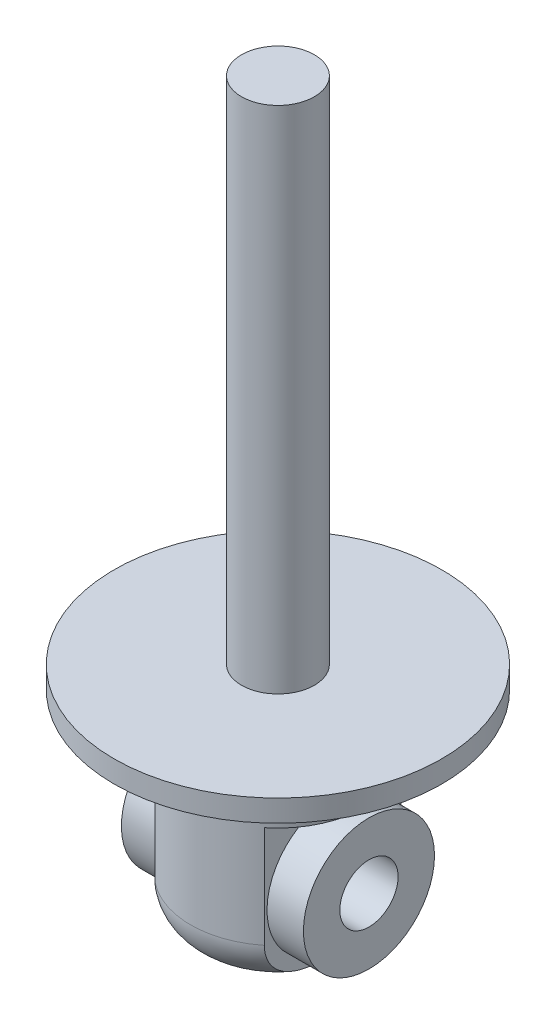
ISO-10303-21;
HEADER;
FILE_DESCRIPTION(('STEP AP214'),'2;1');
FILE_NAME('part.step','',(''),(''),'','','');
FILE_SCHEMA(('AUTOMOTIVE_DESIGN { 1 0 10303 214 1 1 1 1 }'));
ENDSEC;
DATA;
#1=APPLICATION_CONTEXT('core data for automotive mechanical design processes');
#2=APPLICATION_PROTOCOL_DEFINITION('international standard','automotive_design',2000,#1);
#3=PRODUCT_CONTEXT('',#1,'mechanical');
#4=PRODUCT('Part','Part','',(#3));
#5=PRODUCT_RELATED_PRODUCT_CATEGORY('part','',(#4));
#6=PRODUCT_DEFINITION_FORMATION('','',#4);
#7=PRODUCT_DEFINITION_CONTEXT('part definition',#1,'design');
#8=PRODUCT_DEFINITION('design','',#6,#7);
#9=PRODUCT_DEFINITION_SHAPE('','',#8);
#10=(LENGTH_UNIT() NAMED_UNIT(*) SI_UNIT(.MILLI.,.METRE.));
#11=(NAMED_UNIT(*) PLANE_ANGLE_UNIT() SI_UNIT($,.RADIAN.));
#12=(NAMED_UNIT(*) SI_UNIT($,.STERADIAN.) SOLID_ANGLE_UNIT());
#13=UNCERTAINTY_MEASURE_WITH_UNIT(LENGTH_MEASURE(1.E-05),#10,'distance_accuracy_value','');
#14=(GEOMETRIC_REPRESENTATION_CONTEXT(3) GLOBAL_UNCERTAINTY_ASSIGNED_CONTEXT((#13)) GLOBAL_UNIT_ASSIGNED_CONTEXT((#10,
#11,#12)) REPRESENTATION_CONTEXT('',''));
#15=CARTESIAN_POINT('',(0.,0.,0.));
#16=DIRECTION('',(0.,0.,1.));
#17=DIRECTION('',(1.,0.,0.));
#18=AXIS2_PLACEMENT_3D('',#15,#16,#17);
#19=CARTESIAN_POINT('',(7.5,-8.,-22.5));
#20=DIRECTION('',(-1.,0.,0.));
#21=DIRECTION('',(0.,-1.,0.));
#22=AXIS2_PLACEMENT_3D('',#19,#20,#21);
#23=PLANE('',#22);
#24=CARTESIAN_POINT('',(7.5,-27.8094750193111,0.));
#25=CARTESIAN_POINT('',(7.5,-27.8094752958151,-0.18452162824242));
#26=CARTESIAN_POINT('',(7.5,-27.8077270322999,-0.369043480287192));
#27=CARTESIAN_POINT('',(7.5,-27.8006130628877,-0.737999394292286));
#28=CARTESIAN_POINT('',(7.5,-27.7952477367066,-0.922433463434386));
#29=CARTESIAN_POINT('',(7.5,-27.780538513706,-1.29122559425462));
#30=CARTESIAN_POINT('',(7.5,-27.7711929215574,-1.47558358999919));
#31=CARTESIAN_POINT('',(7.5,-27.7479507640883,-1.84401846668315));
#32=CARTESIAN_POINT('',(7.5,-27.734054140347,-2.0280953439834));
#33=CARTESIAN_POINT('',(7.5,-27.701027325669,-2.39498843631837));
#34=CARTESIAN_POINT('',(7.5,-27.6819201299087,-2.57780665418327));
#35=CARTESIAN_POINT('',(7.5,-27.6375682217561,-2.94269408038084));
#36=CARTESIAN_POINT('',(7.5,-27.6123230495969,-3.12476323156505));
#37=CARTESIAN_POINT('',(7.5,-27.5259360262262,-3.6691632505479));
#38=CARTESIAN_POINT('',(7.5,-27.4541196223952,-4.02997739530099));
#39=CARTESIAN_POINT('',(7.5,-27.315114172541,-4.57935988961709));
#40=CARTESIAN_POINT('',(7.5,-27.2608348848703,-4.7712225645297));
#41=CARTESIAN_POINT('',(7.5,-27.1402411036094,-5.15109529504943));
#42=CARTESIAN_POINT('',(7.5,-27.0739312594077,-5.3391068078654));
#43=CARTESIAN_POINT('',(7.5,-26.9281486989919,-5.70992505463464));
#44=CARTESIAN_POINT('',(7.5,-26.8486797977089,-5.8927332791208));
#45=CARTESIAN_POINT('',(7.5,-26.6756224712841,-6.25155879665884));
#46=CARTESIAN_POINT('',(7.5,-26.5820364486501,-6.4275772388346));
#47=CARTESIAN_POINT('',(7.5,-26.3958384208508,-6.74413785402998));
#48=CARTESIAN_POINT('',(7.5,-26.3053527427416,-6.8859302136676));
#49=CARTESIAN_POINT('',(7.5,-26.1136422044668,-7.16205254122039));
#50=CARTESIAN_POINT('',(7.5,-26.0124194056704,-7.29638393401337));
#51=CARTESIAN_POINT('',(7.5,-25.7991822855038,-7.55627452274062));
#52=CARTESIAN_POINT('',(7.5,-25.6871652583255,-7.6818315054992));
#53=CARTESIAN_POINT('',(7.5,-25.4525813942248,-7.92270374400352));
#54=CARTESIAN_POINT('',(7.5,-25.3300144777409,-8.03801892249803));
#55=CARTESIAN_POINT('',(7.5,-25.0736714823962,-8.25792234562975));
#56=CARTESIAN_POINT('',(7.5,-24.9398051473305,-8.36240569865935));
#57=CARTESIAN_POINT('',(7.5,-24.662616920615,-8.55796576900282));
#58=CARTESIAN_POINT('',(7.5,-24.5192963548439,-8.64904436046083));
#59=CARTESIAN_POINT('',(7.5,-24.2243409104845,-8.81636481076627));
#60=CARTESIAN_POINT('',(7.5,-24.0727112205184,-8.89261579636783));
#61=CARTESIAN_POINT('',(7.5,-23.7624095052739,-9.02909243430965));
#62=CARTESIAN_POINT('',(7.5,-23.6037388369551,-9.08932115899453));
#63=CARTESIAN_POINT('',(7.5,-23.3052245459151,-9.1849514334904));
#64=CARTESIAN_POINT('',(7.5,-23.166136129491,-9.22272405795733));
#65=CARTESIAN_POINT('',(7.5,-22.8851087613884,-9.28547940350164));
#66=CARTESIAN_POINT('',(7.5,-22.7431701638949,-9.31046370365637));
#67=CARTESIAN_POINT('',(7.5,-22.4576599589478,-9.34730641699015));
#68=CARTESIAN_POINT('',(7.5,-22.3140890586128,-9.35917031033292));
#69=CARTESIAN_POINT('',(7.5,-22.0264648581988,-9.36963164548865));
#70=CARTESIAN_POINT('',(7.5,-21.8824115750842,-9.36822954903947));
#71=CARTESIAN_POINT('',(7.5,-21.6061914815275,-9.35280339576898));
#72=CARTESIAN_POINT('',(7.5,-21.4739684759153,-9.33976569953801));
#73=CARTESIAN_POINT('',(7.5,-21.2110534946456,-9.3025636387872));
#74=CARTESIAN_POINT('',(7.5,-21.0803620180608,-9.27839574533065));
#75=CARTESIAN_POINT('',(7.5,-20.8215410609612,-9.21922065645586));
#76=CARTESIAN_POINT('',(7.5,-20.6934101253726,-9.1842198149556));
#77=CARTESIAN_POINT('',(7.5,-20.4404340442512,-9.1037455253616));
#78=CARTESIAN_POINT('',(7.5,-20.3155901493276,-9.05826815366643));
#79=CARTESIAN_POINT('',(7.5,-20.0692031015505,-8.95699564520569));
#80=CARTESIAN_POINT('',(7.5,-19.9476868658852,-8.90113499399755));
#81=CARTESIAN_POINT('',(7.5,-19.7094920695403,-8.77987692751896));
#82=CARTESIAN_POINT('',(7.5,-19.5928152563103,-8.71447610526942));
#83=CARTESIAN_POINT('',(7.5,-19.2509911073174,-8.50489875856371));
#84=CARTESIAN_POINT('',(7.5,-19.0339195251877,-8.34729299116934));
#85=CARTESIAN_POINT('',(7.5,-18.609337427954,-7.98870608163152));
#86=CARTESIAN_POINT('',(7.5,-18.4039002281567,-7.78529755950601));
#87=CARTESIAN_POINT('',(7.5,-18.0246758733926,-7.35109040646742));
#88=CARTESIAN_POINT('',(7.5,-17.8508837047537,-7.12029612399674));
#89=CARTESIAN_POINT('',(7.5,-17.5744409595824,-6.69864287979115));
#90=CARTESIAN_POINT('',(7.5,-17.4648689537028,-6.51223410047273));
#91=CARTESIAN_POINT('',(7.5,-17.2626904112623,-6.13034538679086));
#92=CARTESIAN_POINT('',(7.5,-17.1700919878543,-5.93486117014358));
#93=CARTESIAN_POINT('',(7.5,-17.0006313082269,-5.53658641063457));
#94=CARTESIAN_POINT('',(7.5,-16.9238147555949,-5.3337765932138));
#95=CARTESIAN_POINT('',(7.5,-16.784875362625,-4.9233142846081));
#96=CARTESIAN_POINT('',(7.5,-16.7227484430634,-4.71566315546474));
#97=CARTESIAN_POINT('',(7.5,-16.5386673542946,-4.02250667384635));
#98=CARTESIAN_POINT('',(7.5,-16.4449803111871,-3.52942656369881));
#99=CARTESIAN_POINT('',(7.5,-16.3412352530644,-2.78498720051466));
#100=CARTESIAN_POINT('',(7.5,-16.3127705467372,-2.53568557770049));
#101=CARTESIAN_POINT('',(7.5,-16.2658269581612,-2.03612434937438));
#102=CARTESIAN_POINT('',(7.5,-16.2473468655649,-1.78586486368141));
#103=CARTESIAN_POINT('',(7.5,-16.2184283009414,-1.28363112408652));
#104=CARTESIAN_POINT('',(7.5,-16.208031590786,-1.03165466176091));
#105=CARTESIAN_POINT('',(7.5,-16.1941849220444,-0.527501194688676));
#106=CARTESIAN_POINT('',(7.5,-16.1907352988047,-0.275324180848907));
#107=CARTESIAN_POINT('',(7.5,-16.1903333462322,0.22873134560298));
#108=CARTESIAN_POINT('',(7.5,-16.193373232494,0.480609853630178));
#109=CARTESIAN_POINT('',(7.5,-16.2063332691715,0.98417358149427));
#110=CARTESIAN_POINT('',(7.5,-16.2162528039696,1.23585881660874));
#111=CARTESIAN_POINT('',(7.5,-16.2454935008677,1.76278825668934));
#112=CARTESIAN_POINT('',(7.5,-16.2656211327378,2.03798990109172));
#113=CARTESIAN_POINT('',(7.5,-16.3180418431018,2.58731345976839));
#114=CARTESIAN_POINT('',(7.5,-16.3503365349836,2.86143522597444));
#115=CARTESIAN_POINT('',(7.5,-16.4300545548583,3.40623279358437));
#116=CARTESIAN_POINT('',(7.5,-16.4774071358833,3.67691867401874));
#117=CARTESIAN_POINT('',(7.5,-16.5907053400646,4.21439476079952));
#118=CARTESIAN_POINT('',(7.5,-16.6566449229111,4.4811862031647));
#119=CARTESIAN_POINT('',(7.5,-16.7911834026755,4.94217748017443));
#120=CARTESIAN_POINT('',(7.5,-16.8549558474619,5.13778160857807));
#121=CARTESIAN_POINT('',(7.5,-16.9961265709521,5.5239942274174));
#122=CARTESIAN_POINT('',(7.5,-17.073520789267,5.71460418712137));
#123=CARTESIAN_POINT('',(7.5,-17.2430793617625,6.0892198722189));
#124=CARTESIAN_POINT('',(7.5,-17.3352463319138,6.27322442084438));
#125=CARTESIAN_POINT('',(7.5,-17.5351759469553,6.63256976145457));
#126=CARTESIAN_POINT('',(7.5,-17.6429345063483,6.80791280693598));
#127=CARTESIAN_POINT('',(7.5,-17.8487615005737,7.10989658300674));
#128=CARTESIAN_POINT('',(7.5,-17.9436617626469,7.23870103997639));
#129=CARTESIAN_POINT('',(7.5,-18.143229826346,7.48856622066219));
#130=CARTESIAN_POINT('',(7.5,-18.2478987883735,7.60962602152205));
#131=CARTESIAN_POINT('',(7.5,-18.4668045949393,7.84271387792475));
#132=CARTESIAN_POINT('',(7.5,-18.5810384459287,7.95474473789613));
#133=CARTESIAN_POINT('',(7.5,-18.8187268203134,8.16854933672495));
#134=CARTESIAN_POINT('',(7.5,-18.9421800591116,8.27032449994957));
#135=CARTESIAN_POINT('',(7.5,-19.1987356397018,8.46313596223061));
#136=CARTESIAN_POINT('',(7.5,-19.3319055781875,8.55408255407203));
#137=CARTESIAN_POINT('',(7.5,-19.6061418402457,8.72304401015933));
#138=CARTESIAN_POINT('',(7.5,-19.747204378254,8.80106500403696));
#139=CARTESIAN_POINT('',(7.5,-20.0362068877473,8.94309470867638));
#140=CARTESIAN_POINT('',(7.5,-20.1841460034049,9.00710515749597));
#141=CARTESIAN_POINT('',(7.5,-20.4856380297523,9.12014361193692));
#142=CARTESIAN_POINT('',(7.5,-20.6391901444676,9.16917373274798));
#143=CARTESIAN_POINT('',(7.5,-20.9313639562727,9.24643392787081));
#144=CARTESIAN_POINT('',(7.5,-21.0695088202567,9.27647685632879));
#145=CARTESIAN_POINT('',(7.5,-21.3479315795213,9.32406143536891));
#146=CARTESIAN_POINT('',(7.5,-21.4882092809527,9.34160421520928));
#147=CARTESIAN_POINT('',(7.5,-21.769719609589,9.36396002322678));
#148=CARTESIAN_POINT('',(7.5,-21.9109518422674,9.36877802253041));
#149=CARTESIAN_POINT('',(7.5,-22.1932734390957,9.36563613906261));
#150=CARTESIAN_POINT('',(7.5,-22.3343628067459,9.35767657732182));
#151=CARTESIAN_POINT('',(7.5,-22.6064011749062,9.32998563551062));
#152=CARTESIAN_POINT('',(7.5,-22.7374295539783,9.31102660205278));
#153=CARTESIAN_POINT('',(7.5,-22.9974780227225,9.26218788836621));
#154=CARTESIAN_POINT('',(7.5,-23.1264974548056,9.23230470755187));
#155=CARTESIAN_POINT('',(7.5,-23.3815508516768,9.16196479385525));
#156=CARTESIAN_POINT('',(7.5,-23.5075862018083,9.12151307666088));
#157=CARTESIAN_POINT('',(7.5,-23.7559772755244,9.03044888037393));
#158=CARTESIAN_POINT('',(7.5,-23.8783315975104,8.97983258590813));
#159=CARTESIAN_POINT('',(7.5,-24.1205569584555,8.8680617574251));
#160=CARTESIAN_POINT('',(7.5,-24.2403549182387,8.8067487702029));
#161=CARTESIAN_POINT('',(7.5,-24.4747211723639,8.67480187441993));
#162=CARTESIAN_POINT('',(7.5,-24.5892875713423,8.60416462323317));
#163=CARTESIAN_POINT('',(7.5,-24.9242270275788,8.37928997825773));
#164=CARTESIAN_POINT('',(7.5,-25.13600210755,8.21201407264852));
#165=CARTESIAN_POINT('',(7.5,-25.5504485361803,7.832942739178));
#166=CARTESIAN_POINT('',(7.5,-25.7507010772538,7.61853228584699));
#167=CARTESIAN_POINT('',(7.5,-26.1185076671662,7.16337882817298));
#168=CARTESIAN_POINT('',(7.5,-26.2860513710234,6.92262753032979));
#169=CARTESIAN_POINT('',(7.5,-26.5545024709803,6.4788664395953));
#170=CARTESIAN_POINT('',(7.5,-26.6619013252763,6.279707295078));
#171=CARTESIAN_POINT('',(7.5,-26.858559219587,5.87254463104013));
#172=CARTESIAN_POINT('',(7.5,-26.9478095430477,5.66453691936401));
#173=CARTESIAN_POINT('',(7.5,-27.1096214973705,5.24180758530233));
#174=CARTESIAN_POINT('',(7.5,-27.1821555960046,5.02707553901331));
#175=CARTESIAN_POINT('',(7.5,-27.3121001369762,4.59305326757355));
#176=CARTESIAN_POINT('',(7.5,-27.3695048137837,4.37376133898656));
#177=CARTESIAN_POINT('',(7.5,-27.4981886749365,3.81417726059937));
#178=CARTESIAN_POINT('',(7.5,-27.5604951716191,3.47183296905169));
#179=CARTESIAN_POINT('',(7.5,-27.6609019684328,2.78359200614869));
#180=CARTESIAN_POINT('',(7.5,-27.6989863972919,2.43769315620305));
#181=CARTESIAN_POINT('',(7.5,-27.7425563308733,1.91723181279187));
#182=CARTESIAN_POINT('',(7.5,-27.7548291128016,1.74318957751326));
#183=CARTESIAN_POINT('',(7.5,-27.7753986995787,1.39487161182966));
#184=CARTESIAN_POINT('',(7.5,-27.7836956019396,1.22059588725637));
#185=CARTESIAN_POINT('',(7.5,-27.796777523185,0.871965392986035));
#186=CARTESIAN_POINT('',(7.5,-27.8015635129394,0.697610658492168));
#187=CARTESIAN_POINT('',(7.5,-27.8079121855994,0.348837350643893));
#188=CARTESIAN_POINT('',(7.5,-27.8094747579462,0.174418775305038));
#189=CARTESIAN_POINT('',(7.5,-27.8094750193111,0.));
#190=B_SPLINE_CURVE_WITH_KNOTS('',3,(#24,#25,#26,#27,#28,#29,#30,#31,#32,#33,#34,#35,#36,#37,
#38,#39,#40,#41,#42,#43,#44,#45,#46,#47,#48,#49,#50,#51,#52,#53,#54,#55,#56,#57,#58,#59,#60,#61,
#62,#63,#64,#65,#66,#67,#68,#69,#70,#71,#72,#73,#74,#75,#76,#77,#78,#79,#80,#81,#82,#83,#84,#85,
#86,#87,#88,#89,#90,#91,#92,#93,#94,#95,#96,#97,#98,#99,#100,#101,#102,#103,#104,#105,#106,#107,
#108,#109,#110,#111,#112,#113,#114,#115,#116,#117,#118,#119,#120,#121,#122,#123,#124,#125,#126,
#127,#128,#129,#130,#131,#132,#133,#134,#135,#136,#137,#138,#139,#140,#141,#142,#143,#144,#145,
#146,#147,#148,#149,#150,#151,#152,#153,#154,#155,#156,#157,#158,#159,#160,#161,#162,#163,#164,
#165,#166,#167,#168,#169,#170,#171,#172,#173,#174,#175,#176,#177,#178,#179,#180,#181,#182,#183,
#184,#185,#186,#187,#188,#189),.UNSPECIFIED.,.T.,.F.,(4,2,2,2,2,2,2,2,2,2,2,2,2,2,2,2,2,2,2,2,2,
2,2,2,2,2,2,2,2,2,2,2,2,2,2,2,2,2,2,2,2,2,2,2,2,2,2,2,2,2,2,2,2,2,2,2,2,2,2,2,2,2,2,2,2,2,2,2,2,
2,2,2,2,2,2,2,2,2,2,2,2,2,4),(0.,0.553556541747909,1.10705498067111,1.66078940935171,
2.21453094651203,2.7658672034967,3.31724477121585,4.41912680182767,5.01698525599298,
5.61461314908643,6.21206808675635,6.80942146164093,7.31357153503217,7.81762499361292,
8.32180513447662,8.82598907791494,9.33467160980089,9.84328295415677,10.3515802378956,
10.8597799828438,11.291588037567,11.7233427606026,12.1549170790764,12.5864763761707,
12.9845986570771,13.3828472534997,13.7808627038906,14.1790274594522,14.579795450788,
14.9807069160888,15.7821103743006,16.6461503316802,17.5100532757815,18.1578732554314,
18.8060020817716,19.4559821948789,20.1057815998326,21.6069748462106,22.3596793389022,
23.1122925673176,23.8687687149109,24.6252813779039,25.3808870860739,26.1364251884592,
26.9640249034878,27.7917343993232,28.6156111127982,29.4392203950451,30.0559954213971,
30.6725869093733,31.2892877047367,31.9058271963483,32.3853559200308,32.86494167852,
33.3443778968313,33.823747436381,34.3068464150843,34.7897156366603,35.2725249226045,
35.7552660053908,36.1788379642465,36.6023716529343,37.0257398573389,37.4490974249689,
37.8458122806135,38.2426543730445,38.639308470493,39.0361117351622,39.4393886143668,
39.8428104576491,40.6491243408277,41.5260051520067,42.4031628508039,43.0810551134699,
43.7592721958252,44.4385984678267,45.1181832448308,46.1608437011148,47.2041866484774,
47.7275747628343,48.2509500399341,48.7741805338585,49.2974289735857),.UNSPECIFIED.);
#191=CARTESIAN_POINT('',(7.5,-22.,9.3674969975976));
#192=VERTEX_POINT('',#191);
#193=CARTESIAN_POINT('',(7.5,-21.9999999999999,-9.36749699759765));
#194=VERTEX_POINT('',#193);
#195=EDGE_CURVE('E84',#192,#194,#190,.T.);
#196=ORIENTED_EDGE('',*,*,#195,.T.);
#197=DIRECTION('',(0.,1.,0.));
#198=VECTOR('',#197,1.);
#199=CARTESIAN_POINT('',(7.5,-28.,-9.3674969975976));
#200=LINE('',#199,#198);
#201=CARTESIAN_POINT('',(7.5,-8.,-9.3674969975976));
#202=VERTEX_POINT('',#201);
#203=EDGE_CURVE('E98',#202,#194,#200,.F.);
#204=ORIENTED_EDGE('',*,*,#203,.F.);
#205=DIRECTION('',(0.,0.,1.));
#206=VECTOR('',#205,1.);
#207=CARTESIAN_POINT('',(7.5,-8.,-22.5));
#208=LINE('',#207,#206);
#209=CARTESIAN_POINT('',(7.5,-8.,9.36749699759759));
#210=VERTEX_POINT('',#209);
#211=EDGE_CURVE('E88',#202,#210,#208,.T.);
#212=ORIENTED_EDGE('',*,*,#211,.T.);
#213=DIRECTION('',(0.,1.,0.));
#214=VECTOR('',#213,1.);
#215=CARTESIAN_POINT('',(7.5,-28.,9.3674969975976));
#216=LINE('',#215,#214);
#217=EDGE_CURVE('E51',#192,#210,#216,.T.);
#218=ORIENTED_EDGE('',*,*,#217,.F.);
#219=EDGE_LOOP('',(#196,#204,#212,#218));
#220=FACE_BOUND('',#219,.T.);
#221=CARTESIAN_POINT('',(7.5,-18.,0.));
#222=DIRECTION('',(-1.,0.,0.));
#223=DIRECTION('',(0.,-1.,0.));
#224=AXIS2_PLACEMENT_3D('',#221,#222,#223);
#225=CIRCLE('',#224,9.);
#226=CARTESIAN_POINT('',(7.5,-27.,0.));
#227=VERTEX_POINT('',#226);
#228=EDGE_CURVE('E11',#227,#227,#225,.F.);
#229=ORIENTED_EDGE('',*,*,#228,.F.);
#230=EDGE_LOOP('',(#229));
#231=FACE_BOUND('',#230,.T.);
#232=ADVANCED_FACE('F35',(#220,#231),#23,.F.);
#233=CARTESIAN_POINT('',(0.,3.,0.));
#234=DIRECTION('',(0.,-1.,0.));
#235=DIRECTION('',(0.,0.,-1.));
#236=AXIS2_PLACEMENT_3D('',#233,#234,#235);
#237=CYLINDRICAL_SURFACE('',#236,22.5);
#238=CARTESIAN_POINT('',(0.,3.,0.));
#239=DIRECTION('',(0.,1.,0.));
#240=DIRECTION('',(0.,0.,1.));
#241=AXIS2_PLACEMENT_3D('',#238,#239,#240);
#242=CIRCLE('',#241,22.5);
#243=CARTESIAN_POINT('',(0.,3.,22.5));
#244=VERTEX_POINT('',#243);
#245=EDGE_CURVE('E115',#244,#244,#242,.T.);
#246=ORIENTED_EDGE('',*,*,#245,.F.);
#247=EDGE_LOOP('',(#246));
#248=FACE_BOUND('',#247,.T.);
#249=CARTESIAN_POINT('',(0.,0.,0.));
#250=DIRECTION('',(0.,1.,0.));
#251=DIRECTION('',(0.,0.,1.));
#252=AXIS2_PLACEMENT_3D('',#249,#250,#251);
#253=CIRCLE('',#252,22.5);
#254=CARTESIAN_POINT('',(0.,0.,22.5));
#255=VERTEX_POINT('',#254);
#256=EDGE_CURVE('E112',#255,#255,#253,.T.);
#257=ORIENTED_EDGE('',*,*,#256,.T.);
#258=EDGE_LOOP('',(#257));
#259=FACE_BOUND('',#258,.T.);
#260=ADVANCED_FACE('F159',(#248,#259),#237,.T.);
#261=CARTESIAN_POINT('',(0.,3.,0.));
#262=DIRECTION('',(0.,1.,0.));
#263=DIRECTION('',(0.,0.,1.));
#264=AXIS2_PLACEMENT_3D('',#261,#262,#263);
#265=PLANE('',#264);
#266=CARTESIAN_POINT('',(0.,3.,0.));
#267=DIRECTION('',(0.,1.,0.));
#268=DIRECTION('',(0.,0.,1.));
#269=AXIS2_PLACEMENT_3D('',#266,#267,#268);
#270=CIRCLE('',#269,5.);
#271=CARTESIAN_POINT('',(0.,3.,5.));
#272=VERTEX_POINT('',#271);
#273=EDGE_CURVE('E109',#272,#272,#270,.T.);
#274=ORIENTED_EDGE('',*,*,#273,.F.);
#275=EDGE_LOOP('',(#274));
#276=FACE_BOUND('',#275,.T.);
#277=ORIENTED_EDGE('',*,*,#245,.T.);
#278=EDGE_LOOP('',(#277));
#279=FACE_BOUND('',#278,.T.);
#280=ADVANCED_FACE('F156',(#276,#279),#265,.T.);
#281=CARTESIAN_POINT('',(0.,0.,0.));
#282=DIRECTION('',(0.,1.,0.));
#283=DIRECTION('',(0.,0.,1.));
#284=AXIS2_PLACEMENT_3D('',#281,#282,#283);
#285=PLANE('',#284);
#286=CARTESIAN_POINT('',(0.,0.,0.));
#287=DIRECTION('',(0.,-1.,0.));
#288=DIRECTION('',(0.,0.,-1.));
#289=AXIS2_PLACEMENT_3D('',#286,#287,#288);
#290=CIRCLE('',#289,12.);
#291=CARTESIAN_POINT('',(0.,0.,-12.));
#292=VERTEX_POINT('',#291);
#293=EDGE_CURVE('E105',#292,#292,#290,.T.);
#294=ORIENTED_EDGE('',*,*,#293,.F.);
#295=EDGE_LOOP('',(#294));
#296=FACE_BOUND('',#295,.T.);
#297=ORIENTED_EDGE('',*,*,#256,.F.);
#298=EDGE_LOOP('',(#297));
#299=FACE_BOUND('',#298,.T.);
#300=ADVANCED_FACE('F154',(#296,#299),#285,.F.);
#301=CARTESIAN_POINT('',(0.,73.,0.));
#302=DIRECTION('',(0.,-1.,0.));
#303=DIRECTION('',(0.,0.,-1.));
#304=AXIS2_PLACEMENT_3D('',#301,#302,#303);
#305=CYLINDRICAL_SURFACE('',#304,5.);
#306=CARTESIAN_POINT('',(0.,73.,0.));
#307=DIRECTION('',(0.,1.,0.));
#308=DIRECTION('',(0.,0.,1.));
#309=AXIS2_PLACEMENT_3D('',#306,#307,#308);
#310=CIRCLE('',#309,5.);
#311=CARTESIAN_POINT('',(0.,73.,5.));
#312=VERTEX_POINT('',#311);
#313=EDGE_CURVE('E104',#312,#312,#310,.T.);
#314=ORIENTED_EDGE('',*,*,#313,.F.);
#315=EDGE_LOOP('',(#314));
#316=FACE_BOUND('',#315,.T.);
#317=ORIENTED_EDGE('',*,*,#273,.T.);
#318=EDGE_LOOP('',(#317));
#319=FACE_BOUND('',#318,.T.);
#320=ADVANCED_FACE('F150',(#316,#319),#305,.T.);
#321=CARTESIAN_POINT('',(0.,73.,0.));
#322=DIRECTION('',(0.,1.,0.));
#323=DIRECTION('',(0.,0.,1.));
#324=AXIS2_PLACEMENT_3D('',#321,#322,#323);
#325=PLANE('',#324);
#326=ORIENTED_EDGE('',*,*,#313,.T.);
#327=EDGE_LOOP('',(#326));
#328=FACE_BOUND('',#327,.T.);
#329=ADVANCED_FACE('F147',(#328),#325,.T.);
#330=CARTESIAN_POINT('',(0.,-28.,0.));
#331=DIRECTION('',(0.,1.,0.));
#332=DIRECTION('',(0.,0.,1.));
#333=AXIS2_PLACEMENT_3D('',#330,#331,#332);
#334=CYLINDRICAL_SURFACE('',#333,12.);
#335=CARTESIAN_POINT('',(0.,-22.,0.));
#336=DIRECTION('',(0.,-1.,0.));
#337=DIRECTION('',(0.,0.,-1.));
#338=AXIS2_PLACEMENT_3D('',#335,#336,#337);
#339=CIRCLE('',#338,12.);
#340=CARTESIAN_POINT('',(-7.5,-21.9999999999999,9.36749699759765));
#341=VERTEX_POINT('',#340);
#342=EDGE_CURVE('E123',#341,#192,#339,.F.);
#343=ORIENTED_EDGE('',*,*,#342,.T.);
#344=ORIENTED_EDGE('',*,*,#217,.T.);
#345=CARTESIAN_POINT('',(0.,-8.,0.));
#346=DIRECTION('',(0.,1.,0.));
#347=DIRECTION('',(-1.,0.,0.));
#348=AXIS2_PLACEMENT_3D('',#345,#346,#347);
#349=CIRCLE('',#348,12.);
#350=EDGE_CURVE('E44',#210,#202,#349,.T.);
#351=ORIENTED_EDGE('',*,*,#350,.T.);
#352=ORIENTED_EDGE('',*,*,#203,.T.);
#353=CARTESIAN_POINT('',(-7.5,-22.,-9.3674969975976));
#354=VERTEX_POINT('',#353);
#355=EDGE_CURVE('E97',#194,#354,#339,.F.);
#356=ORIENTED_EDGE('',*,*,#355,.T.);
#357=DIRECTION('',(0.,1.,0.));
#358=VECTOR('',#357,1.);
#359=CARTESIAN_POINT('',(-7.5,-28.,-9.3674969975976));
#360=LINE('',#359,#358);
#361=CARTESIAN_POINT('',(-7.5,-8.,-9.3674969975976));
#362=VERTEX_POINT('',#361);
#363=EDGE_CURVE('E59',#354,#362,#360,.T.);
#364=ORIENTED_EDGE('',*,*,#363,.T.);
#365=CARTESIAN_POINT('',(0.,-8.,0.));
#366=DIRECTION('',(0.,1.,0.));
#367=DIRECTION('',(-1.,0.,0.));
#368=AXIS2_PLACEMENT_3D('',#365,#366,#367);
#369=CIRCLE('',#368,12.);
#370=CARTESIAN_POINT('',(-7.5,-8.,9.36749699759759));
#371=VERTEX_POINT('',#370);
#372=EDGE_CURVE('E79',#362,#371,#369,.T.);
#373=ORIENTED_EDGE('',*,*,#372,.T.);
#374=DIRECTION('',(0.,1.,0.));
#375=VECTOR('',#374,1.);
#376=CARTESIAN_POINT('',(-7.5,-28.,9.3674969975976));
#377=LINE('',#376,#375);
#378=EDGE_CURVE('E87',#371,#341,#377,.F.);
#379=ORIENTED_EDGE('',*,*,#378,.T.);
#380=EDGE_LOOP('',(#343,#344,#351,#352,#356,#364,#373,#379));
#381=FACE_BOUND('',#380,.T.);
#382=ORIENTED_EDGE('',*,*,#293,.T.);
#383=EDGE_LOOP('',(#382));
#384=FACE_BOUND('',#383,.T.);
#385=ADVANCED_FACE('F93',(#381,#384),#334,.T.);
#386=CARTESIAN_POINT('',(0.,-28.,0.));
#387=DIRECTION('',(0.,-1.,0.));
#388=DIRECTION('',(0.,0.,-1.));
#389=AXIS2_PLACEMENT_3D('',#386,#387,#388);
#390=PLANE('',#389);
#391=CARTESIAN_POINT('',(0.,-28.,0.));
#392=DIRECTION('',(0.,-1.,0.));
#393=DIRECTION('',(0.,0.,-1.));
#394=AXIS2_PLACEMENT_3D('',#391,#392,#393);
#395=CIRCLE('',#394,6.);
#396=CARTESIAN_POINT('',(0.,-28.,-6.));
#397=VERTEX_POINT('',#396);
#398=EDGE_CURVE('E108',#397,#397,#395,.T.);
#399=ORIENTED_EDGE('',*,*,#398,.T.);
#400=EDGE_LOOP('',(#399));
#401=FACE_BOUND('',#400,.T.);
#402=ADVANCED_FACE('F141',(#401),#390,.T.);
#403=CARTESIAN_POINT('',(0.,-22.,0.));
#404=DIRECTION('',(0.,-1.,0.));
#405=DIRECTION('',(0.,0.,-1.));
#406=AXIS2_PLACEMENT_3D('',#403,#404,#405);
#407=TOROIDAL_SURFACE('',#406,6.,6.);
#408=ORIENTED_EDGE('',*,*,#195,.F.);
#409=ORIENTED_EDGE('',*,*,#342,.F.);
#410=CARTESIAN_POINT('',(-7.5,-27.8094750193111,0.));
#411=CARTESIAN_POINT('',(-7.5,-27.8094752958151,0.18452162824242));
#412=CARTESIAN_POINT('',(-7.5,-27.8077270322999,0.369043480287192));
#413=CARTESIAN_POINT('',(-7.5,-27.8006130628877,0.737999394292286));
#414=CARTESIAN_POINT('',(-7.5,-27.7952477367066,0.922433463434386));
#415=CARTESIAN_POINT('',(-7.5,-27.780538513706,1.29122559425462));
#416=CARTESIAN_POINT('',(-7.5,-27.7711929215574,1.47558358999919));
#417=CARTESIAN_POINT('',(-7.5,-27.7479507640883,1.84401846668315));
#418=CARTESIAN_POINT('',(-7.5,-27.734054140347,2.0280953439834));
#419=CARTESIAN_POINT('',(-7.5,-27.701027325669,2.39498843631837));
#420=CARTESIAN_POINT('',(-7.5,-27.6819201299087,2.57780665418327));
#421=CARTESIAN_POINT('',(-7.5,-27.6375682217561,2.94269408038084));
#422=CARTESIAN_POINT('',(-7.5,-27.6123230495969,3.12476323156505));
#423=CARTESIAN_POINT('',(-7.5,-27.5259360262262,3.6691632505479));
#424=CARTESIAN_POINT('',(-7.5,-27.4541196223952,4.02997739530099));
#425=CARTESIAN_POINT('',(-7.5,-27.315114172541,4.57935988961709));
#426=CARTESIAN_POINT('',(-7.5,-27.2608348848703,4.7712225645297));
#427=CARTESIAN_POINT('',(-7.5,-27.1402411036094,5.15109529504943));
#428=CARTESIAN_POINT('',(-7.5,-27.0739312594077,5.3391068078654));
#429=CARTESIAN_POINT('',(-7.5,-26.9281486989919,5.70992505463464));
#430=CARTESIAN_POINT('',(-7.5,-26.8486797977089,5.8927332791208));
#431=CARTESIAN_POINT('',(-7.5,-26.6756224712841,6.25155879665884));
#432=CARTESIAN_POINT('',(-7.5,-26.5820364486501,6.4275772388346));
#433=CARTESIAN_POINT('',(-7.5,-26.3958384208508,6.74413785402998));
#434=CARTESIAN_POINT('',(-7.5,-26.3053527427416,6.8859302136676));
#435=CARTESIAN_POINT('',(-7.5,-26.1136422044668,7.16205254122039));
#436=CARTESIAN_POINT('',(-7.5,-26.0124194056704,7.29638393401337));
#437=CARTESIAN_POINT('',(-7.5,-25.7991822855038,7.55627452274062));
#438=CARTESIAN_POINT('',(-7.5,-25.6871652583255,7.6818315054992));
#439=CARTESIAN_POINT('',(-7.5,-25.4525813942248,7.92270374400352));
#440=CARTESIAN_POINT('',(-7.5,-25.3300144777409,8.03801892249803));
#441=CARTESIAN_POINT('',(-7.5,-25.0736714823962,8.25792234562975));
#442=CARTESIAN_POINT('',(-7.5,-24.9398051473305,8.36240569865935));
#443=CARTESIAN_POINT('',(-7.5,-24.662616920615,8.55796576900282));
#444=CARTESIAN_POINT('',(-7.5,-24.5192963548439,8.64904436046083));
#445=CARTESIAN_POINT('',(-7.5,-24.2243409104845,8.81636481076627));
#446=CARTESIAN_POINT('',(-7.5,-24.0727112205184,8.89261579636783));
#447=CARTESIAN_POINT('',(-7.5,-23.7624095052739,9.02909243430965));
#448=CARTESIAN_POINT('',(-7.5,-23.6037388369551,9.08932115899453));
#449=CARTESIAN_POINT('',(-7.5,-23.3052245459151,9.1849514334904));
#450=CARTESIAN_POINT('',(-7.5,-23.166136129491,9.22272405795733));
#451=CARTESIAN_POINT('',(-7.5,-22.8851087613884,9.28547940350164));
#452=CARTESIAN_POINT('',(-7.5,-22.7431701638949,9.31046370365637));
#453=CARTESIAN_POINT('',(-7.5,-22.4576599589478,9.34730641699015));
#454=CARTESIAN_POINT('',(-7.5,-22.3140890586128,9.35917031033292));
#455=CARTESIAN_POINT('',(-7.5,-22.0264648581988,9.36963164548865));
#456=CARTESIAN_POINT('',(-7.5,-21.8824115750842,9.36822954903947));
#457=CARTESIAN_POINT('',(-7.5,-21.6061914815275,9.35280339576898));
#458=CARTESIAN_POINT('',(-7.5,-21.4739684759153,9.33976569953801));
#459=CARTESIAN_POINT('',(-7.5,-21.2110534946456,9.3025636387872));
#460=CARTESIAN_POINT('',(-7.5,-21.0803620180608,9.27839574533065));
#461=CARTESIAN_POINT('',(-7.5,-20.8215410609612,9.21922065645586));
#462=CARTESIAN_POINT('',(-7.5,-20.6934101253726,9.1842198149556));
#463=CARTESIAN_POINT('',(-7.5,-20.4404340442512,9.1037455253616));
#464=CARTESIAN_POINT('',(-7.5,-20.3155901493276,9.05826815366643));
#465=CARTESIAN_POINT('',(-7.5,-20.0692031015505,8.95699564520569));
#466=CARTESIAN_POINT('',(-7.5,-19.9476868658852,8.90113499399755));
#467=CARTESIAN_POINT('',(-7.5,-19.7094920695403,8.77987692751896));
#468=CARTESIAN_POINT('',(-7.5,-19.5928152563103,8.71447610526942));
#469=CARTESIAN_POINT('',(-7.5,-19.2509911073174,8.50489875856371));
#470=CARTESIAN_POINT('',(-7.5,-19.0339195251877,8.34729299116934));
#471=CARTESIAN_POINT('',(-7.5,-18.609337427954,7.98870608163152));
#472=CARTESIAN_POINT('',(-7.5,-18.4039002281567,7.78529755950601));
#473=CARTESIAN_POINT('',(-7.5,-18.0246758733926,7.35109040646742));
#474=CARTESIAN_POINT('',(-7.5,-17.8508837047537,7.12029612399674));
#475=CARTESIAN_POINT('',(-7.5,-17.5744409595824,6.69864287979115));
#476=CARTESIAN_POINT('',(-7.5,-17.4648689537028,6.51223410047273));
#477=CARTESIAN_POINT('',(-7.5,-17.2626904112623,6.13034538679086));
#478=CARTESIAN_POINT('',(-7.5,-17.1700919878543,5.93486117014358));
#479=CARTESIAN_POINT('',(-7.5,-17.0006313082269,5.53658641063457));
#480=CARTESIAN_POINT('',(-7.5,-16.9238147555949,5.3337765932138));
#481=CARTESIAN_POINT('',(-7.5,-16.784875362625,4.9233142846081));
#482=CARTESIAN_POINT('',(-7.5,-16.7227484430634,4.71566315546474));
#483=CARTESIAN_POINT('',(-7.5,-16.5386673542946,4.02250667384635));
#484=CARTESIAN_POINT('',(-7.5,-16.4449803111871,3.52942656369881));
#485=CARTESIAN_POINT('',(-7.5,-16.3412352530644,2.78498720051466));
#486=CARTESIAN_POINT('',(-7.5,-16.3127705467372,2.53568557770049));
#487=CARTESIAN_POINT('',(-7.5,-16.2658269581612,2.03612434937438));
#488=CARTESIAN_POINT('',(-7.5,-16.2473468655649,1.78586486368141));
#489=CARTESIAN_POINT('',(-7.5,-16.2184283009414,1.28363112408652));
#490=CARTESIAN_POINT('',(-7.5,-16.208031590786,1.03165466176091));
#491=CARTESIAN_POINT('',(-7.5,-16.1941849220444,0.527501194688676));
#492=CARTESIAN_POINT('',(-7.5,-16.1907352988047,0.275324180848907));
#493=CARTESIAN_POINT('',(-7.5,-16.1903333462322,-0.22873134560298));
#494=CARTESIAN_POINT('',(-7.5,-16.193373232494,-0.480609853630178));
#495=CARTESIAN_POINT('',(-7.5,-16.2063332691715,-0.98417358149427));
#496=CARTESIAN_POINT('',(-7.5,-16.2162528039696,-1.23585881660874));
#497=CARTESIAN_POINT('',(-7.5,-16.2454935008677,-1.76278825668934));
#498=CARTESIAN_POINT('',(-7.5,-16.2656211327378,-2.03798990109172));
#499=CARTESIAN_POINT('',(-7.5,-16.3180418431018,-2.58731345976839));
#500=CARTESIAN_POINT('',(-7.5,-16.3503365349836,-2.86143522597444));
#501=CARTESIAN_POINT('',(-7.5,-16.4300545548583,-3.40623279358437));
#502=CARTESIAN_POINT('',(-7.5,-16.4774071358833,-3.67691867401874));
#503=CARTESIAN_POINT('',(-7.5,-16.5907053400646,-4.21439476079952));
#504=CARTESIAN_POINT('',(-7.5,-16.6566449229111,-4.4811862031647));
#505=CARTESIAN_POINT('',(-7.5,-16.7911834026755,-4.94217748017443));
#506=CARTESIAN_POINT('',(-7.5,-16.8549558474619,-5.13778160857807));
#507=CARTESIAN_POINT('',(-7.5,-16.9961265709521,-5.5239942274174));
#508=CARTESIAN_POINT('',(-7.5,-17.073520789267,-5.71460418712137));
#509=CARTESIAN_POINT('',(-7.5,-17.2430793617625,-6.0892198722189));
#510=CARTESIAN_POINT('',(-7.5,-17.3352463319138,-6.27322442084438));
#511=CARTESIAN_POINT('',(-7.5,-17.5351759469553,-6.63256976145457));
#512=CARTESIAN_POINT('',(-7.5,-17.6429345063483,-6.80791280693598));
#513=CARTESIAN_POINT('',(-7.5,-17.8487615005737,-7.10989658300674));
#514=CARTESIAN_POINT('',(-7.5,-17.9436617626469,-7.23870103997639));
#515=CARTESIAN_POINT('',(-7.5,-18.143229826346,-7.48856622066219));
#516=CARTESIAN_POINT('',(-7.5,-18.2478987883735,-7.60962602152205));
#517=CARTESIAN_POINT('',(-7.5,-18.4668045949393,-7.84271387792475));
#518=CARTESIAN_POINT('',(-7.5,-18.5810384459287,-7.95474473789613));
#519=CARTESIAN_POINT('',(-7.5,-18.8187268203134,-8.16854933672495));
#520=CARTESIAN_POINT('',(-7.5,-18.9421800591116,-8.27032449994957));
#521=CARTESIAN_POINT('',(-7.5,-19.1987356397018,-8.46313596223061));
#522=CARTESIAN_POINT('',(-7.5,-19.3319055781875,-8.55408255407203));
#523=CARTESIAN_POINT('',(-7.5,-19.6061418402457,-8.72304401015933));
#524=CARTESIAN_POINT('',(-7.5,-19.747204378254,-8.80106500403696));
#525=CARTESIAN_POINT('',(-7.5,-20.0362068877473,-8.94309470867638));
#526=CARTESIAN_POINT('',(-7.5,-20.1841460034049,-9.00710515749597));
#527=CARTESIAN_POINT('',(-7.5,-20.4856380297523,-9.12014361193692));
#528=CARTESIAN_POINT('',(-7.5,-20.6391901444676,-9.16917373274798));
#529=CARTESIAN_POINT('',(-7.5,-20.9313639562727,-9.24643392787081));
#530=CARTESIAN_POINT('',(-7.5,-21.0695088202567,-9.27647685632879));
#531=CARTESIAN_POINT('',(-7.5,-21.3479315795213,-9.32406143536891));
#532=CARTESIAN_POINT('',(-7.5,-21.4882092809527,-9.34160421520928));
#533=CARTESIAN_POINT('',(-7.5,-21.769719609589,-9.36396002322678));
#534=CARTESIAN_POINT('',(-7.5,-21.9109518422674,-9.36877802253041));
#535=CARTESIAN_POINT('',(-7.5,-22.1932734390957,-9.36563613906261));
#536=CARTESIAN_POINT('',(-7.5,-22.3343628067459,-9.35767657732182));
#537=CARTESIAN_POINT('',(-7.5,-22.6064011749062,-9.32998563551062));
#538=CARTESIAN_POINT('',(-7.5,-22.7374295539783,-9.31102660205278));
#539=CARTESIAN_POINT('',(-7.5,-22.9974780227225,-9.26218788836621));
#540=CARTESIAN_POINT('',(-7.5,-23.1264974548056,-9.23230470755187));
#541=CARTESIAN_POINT('',(-7.5,-23.3815508516768,-9.16196479385525));
#542=CARTESIAN_POINT('',(-7.5,-23.5075862018083,-9.12151307666088));
#543=CARTESIAN_POINT('',(-7.5,-23.7559772755244,-9.03044888037393));
#544=CARTESIAN_POINT('',(-7.5,-23.8783315975104,-8.97983258590813));
#545=CARTESIAN_POINT('',(-7.5,-24.1205569584555,-8.8680617574251));
#546=CARTESIAN_POINT('',(-7.5,-24.2403549182387,-8.8067487702029));
#547=CARTESIAN_POINT('',(-7.5,-24.4747211723639,-8.67480187441993));
#548=CARTESIAN_POINT('',(-7.5,-24.5892875713423,-8.60416462323317));
#549=CARTESIAN_POINT('',(-7.5,-24.9242270275788,-8.37928997825773));
#550=CARTESIAN_POINT('',(-7.5,-25.13600210755,-8.21201407264852));
#551=CARTESIAN_POINT('',(-7.5,-25.5504485361803,-7.832942739178));
#552=CARTESIAN_POINT('',(-7.5,-25.7507010772538,-7.61853228584699));
#553=CARTESIAN_POINT('',(-7.5,-26.1185076671662,-7.16337882817298));
#554=CARTESIAN_POINT('',(-7.5,-26.2860513710234,-6.92262753032979));
#555=CARTESIAN_POINT('',(-7.5,-26.5545024709803,-6.4788664395953));
#556=CARTESIAN_POINT('',(-7.5,-26.6619013252763,-6.279707295078));
#557=CARTESIAN_POINT('',(-7.5,-26.858559219587,-5.87254463104013));
#558=CARTESIAN_POINT('',(-7.5,-26.9478095430477,-5.66453691936401));
#559=CARTESIAN_POINT('',(-7.5,-27.1096214973705,-5.24180758530233));
#560=CARTESIAN_POINT('',(-7.5,-27.1821555960046,-5.02707553901331));
#561=CARTESIAN_POINT('',(-7.5,-27.3121001369762,-4.59305326757355));
#562=CARTESIAN_POINT('',(-7.5,-27.3695048137837,-4.37376133898656));
#563=CARTESIAN_POINT('',(-7.5,-27.4981886749365,-3.81417726059937));
#564=CARTESIAN_POINT('',(-7.5,-27.5604951716191,-3.47183296905169));
#565=CARTESIAN_POINT('',(-7.5,-27.6609019684328,-2.78359200614869));
#566=CARTESIAN_POINT('',(-7.5,-27.6989863972919,-2.43769315620305));
#567=CARTESIAN_POINT('',(-7.5,-27.7425563308733,-1.91723181279187));
#568=CARTESIAN_POINT('',(-7.5,-27.7548291128016,-1.74318957751326));
#569=CARTESIAN_POINT('',(-7.5,-27.7753986995787,-1.39487161182966));
#570=CARTESIAN_POINT('',(-7.5,-27.7836956019396,-1.22059588725637));
#571=CARTESIAN_POINT('',(-7.5,-27.796777523185,-0.871965392986035));
#572=CARTESIAN_POINT('',(-7.5,-27.8015635129394,-0.697610658492168));
#573=CARTESIAN_POINT('',(-7.5,-27.8079121855994,-0.348837350643893));
#574=CARTESIAN_POINT('',(-7.5,-27.8094747579462,-0.174418775305038));
#575=CARTESIAN_POINT('',(-7.5,-27.8094750193111,0.));
#576=B_SPLINE_CURVE_WITH_KNOTS('',3,(#410,#411,#412,#413,#414,#415,#416,#417,#418,#419,#420,
#421,#422,#423,#424,#425,#426,#427,#428,#429,#430,#431,#432,#433,#434,#435,#436,#437,#438,#439,
#440,#441,#442,#443,#444,#445,#446,#447,#448,#449,#450,#451,#452,#453,#454,#455,#456,#457,#458,
#459,#460,#461,#462,#463,#464,#465,#466,#467,#468,#469,#470,#471,#472,#473,#474,#475,#476,#477,
#478,#479,#480,#481,#482,#483,#484,#485,#486,#487,#488,#489,#490,#491,#492,#493,#494,#495,#496,
#497,#498,#499,#500,#501,#502,#503,#504,#505,#506,#507,#508,#509,#510,#511,#512,#513,#514,#515,
#516,#517,#518,#519,#520,#521,#522,#523,#524,#525,#526,#527,#528,#529,#530,#531,#532,#533,#534,
#535,#536,#537,#538,#539,#540,#541,#542,#543,#544,#545,#546,#547,#548,#549,#550,#551,#552,#553,
#554,#555,#556,#557,#558,#559,#560,#561,#562,#563,#564,#565,#566,#567,#568,#569,#570,#571,#572,
#573,#574,#575),.UNSPECIFIED.,.T.,.F.,(4,2,2,2,2,2,2,2,2,2,2,2,2,2,2,2,2,2,2,2,2,2,2,2,2,2,2,2,
2,2,2,2,2,2,2,2,2,2,2,2,2,2,2,2,2,2,2,2,2,2,2,2,2,2,2,2,2,2,2,2,2,2,2,2,2,2,2,2,2,2,2,2,2,2,2,2,
2,2,2,2,2,2,4),(0.,0.553556541747909,1.10705498067111,1.66078940935171,2.21453094651203,
2.7658672034967,3.31724477121585,4.41912680182767,5.01698525599298,5.61461314908643,
6.21206808675635,6.80942146164093,7.31357153503217,7.81762499361292,8.32180513447662,
8.82598907791494,9.33467160980089,9.84328295415677,10.3515802378956,10.8597799828438,
11.291588037567,11.7233427606026,12.1549170790764,12.5864763761707,12.9845986570771,
13.3828472534997,13.7808627038906,14.1790274594522,14.579795450788,14.9807069160888,
15.7821103743006,16.6461503316802,17.5100532757815,18.1578732554314,18.8060020817716,
19.4559821948789,20.1057815998326,21.6069748462106,22.3596793389022,23.1122925673176,
23.8687687149109,24.6252813779039,25.3808870860739,26.1364251884592,26.9640249034878,
27.7917343993232,28.6156111127982,29.4392203950451,30.0559954213971,30.6725869093733,
31.2892877047367,31.9058271963483,32.3853559200308,32.86494167852,33.3443778968313,
33.823747436381,34.3068464150843,34.7897156366603,35.2725249226045,35.7552660053908,
36.1788379642465,36.6023716529343,37.0257398573389,37.4490974249689,37.8458122806135,
38.2426543730445,38.639308470493,39.0361117351622,39.4393886143668,39.8428104576491,
40.6491243408277,41.5260051520067,42.4031628508039,43.0810551134699,43.7592721958252,
44.4385984678267,45.1181832448308,46.1608437011148,47.2041866484774,47.7275747628343,
48.2509500399341,48.7741805338585,49.2974289735857),.UNSPECIFIED.);
#577=EDGE_CURVE('E124',#354,#341,#576,.T.);
#578=ORIENTED_EDGE('',*,*,#577,.F.);
#579=ORIENTED_EDGE('',*,*,#355,.F.);
#580=EDGE_LOOP('',(#408,#409,#578,#579));
#581=FACE_BOUND('',#580,.T.);
#582=ORIENTED_EDGE('',*,*,#398,.F.);
#583=EDGE_LOOP('',(#582));
#584=FACE_BOUND('',#583,.T.);
#585=ADVANCED_FACE('F37',(#581,#584),#407,.T.);
#586=CARTESIAN_POINT('',(-29.0311619945623,-8.,-22.5));
#587=DIRECTION('',(0.,1.,0.));
#588=DIRECTION('',(-1.,0.,0.));
#589=AXIS2_PLACEMENT_3D('',#586,#587,#588);
#590=PLANE('',#589);
#591=DIRECTION('',(0.,0.,1.));
#592=VECTOR('',#591,1.);
#593=CARTESIAN_POINT('',(-7.5,-8.,-22.5));
#594=LINE('',#593,#592);
#595=EDGE_CURVE('E81',#362,#371,#594,.T.);
#596=ORIENTED_EDGE('',*,*,#595,.T.);
#597=ORIENTED_EDGE('',*,*,#372,.F.);
#598=EDGE_LOOP('',(#596,#597));
#599=FACE_BOUND('',#598,.T.);
#600=ADVANCED_FACE('F80',(#599),#590,.F.);
#601=CARTESIAN_POINT('',(-7.5,-8.,-22.5));
#602=DIRECTION('',(1.,0.,0.));
#603=DIRECTION('',(0.,1.,0.));
#604=AXIS2_PLACEMENT_3D('',#601,#602,#603);
#605=PLANE('',#604);
#606=CARTESIAN_POINT('',(-7.5,-18.,0.));
#607=DIRECTION('',(1.,0.,0.));
#608=DIRECTION('',(0.,1.,0.));
#609=AXIS2_PLACEMENT_3D('',#606,#607,#608);
#610=CIRCLE('',#609,9.);
#611=CARTESIAN_POINT('',(-7.5,-9.,0.));
#612=VERTEX_POINT('',#611);
#613=EDGE_CURVE('E259',#612,#612,#610,.T.);
#614=ORIENTED_EDGE('',*,*,#613,.T.);
#615=EDGE_LOOP('',(#614));
#616=FACE_BOUND('',#615,.T.);
#617=ORIENTED_EDGE('',*,*,#577,.T.);
#618=ORIENTED_EDGE('',*,*,#378,.F.);
#619=ORIENTED_EDGE('',*,*,#595,.F.);
#620=ORIENTED_EDGE('',*,*,#363,.F.);
#621=EDGE_LOOP('',(#617,#618,#619,#620));
#622=FACE_BOUND('',#621,.T.);
#623=ADVANCED_FACE('F86',(#616,#622),#605,.F.);
#624=CARTESIAN_POINT('',(29.0311619945623,-8.,-22.5));
#625=DIRECTION('',(0.,1.,0.));
#626=DIRECTION('',(-1.,0.,0.));
#627=AXIS2_PLACEMENT_3D('',#624,#625,#626);
#628=PLANE('',#627);
#629=ORIENTED_EDGE('',*,*,#211,.F.);
#630=ORIENTED_EDGE('',*,*,#350,.F.);
#631=EDGE_LOOP('',(#629,#630));
#632=FACE_BOUND('',#631,.T.);
#633=ADVANCED_FACE('F138',(#632),#628,.F.);
#634=CARTESIAN_POINT('',(-22.5,-18.,0.));
#635=DIRECTION('',(1.,0.,0.));
#636=DIRECTION('',(0.,1.,0.));
#637=AXIS2_PLACEMENT_3D('',#634,#635,#636);
#638=CYLINDRICAL_SURFACE('',#637,4.);
#639=CARTESIAN_POINT('',(12.5,-18.,0.));
#640=DIRECTION('',(1.,0.,0.));
#641=DIRECTION('',(0.,1.,0.));
#642=AXIS2_PLACEMENT_3D('',#639,#640,#641);
#643=CIRCLE('',#642,4.);
#644=CARTESIAN_POINT('',(12.5,-14.,0.));
#645=VERTEX_POINT('',#644);
#646=EDGE_CURVE('E253',#645,#645,#643,.T.);
#647=ORIENTED_EDGE('',*,*,#646,.T.);
#648=EDGE_LOOP('',(#647));
#649=FACE_BOUND('',#648,.T.);
#650=CARTESIAN_POINT('',(-12.5,-18.,0.));
#651=DIRECTION('',(1.,0.,0.));
#652=DIRECTION('',(0.,1.,0.));
#653=AXIS2_PLACEMENT_3D('',#650,#651,#652);
#654=CIRCLE('',#653,4.);
#655=CARTESIAN_POINT('',(-12.5,-14.,0.));
#656=VERTEX_POINT('',#655);
#657=EDGE_CURVE('E262',#656,#656,#654,.T.);
#658=ORIENTED_EDGE('',*,*,#657,.F.);
#659=EDGE_LOOP('',(#658));
#660=FACE_BOUND('',#659,.T.);
#661=ADVANCED_FACE('F178',(#649,#660),#638,.F.);
#662=CARTESIAN_POINT('',(12.5,-18.,0.));
#663=DIRECTION('',(1.,0.,0.));
#664=DIRECTION('',(0.,1.,0.));
#665=AXIS2_PLACEMENT_3D('',#662,#663,#664);
#666=PLANE('',#665);
#667=CARTESIAN_POINT('',(12.5,-18.,0.));
#668=DIRECTION('',(1.,0.,0.));
#669=DIRECTION('',(0.,1.,0.));
#670=AXIS2_PLACEMENT_3D('',#667,#668,#669);
#671=CIRCLE('',#670,9.);
#672=CARTESIAN_POINT('',(12.5,-9.,0.));
#673=VERTEX_POINT('',#672);
#674=EDGE_CURVE('E89',#673,#673,#671,.T.);
#675=ORIENTED_EDGE('',*,*,#674,.T.);
#676=EDGE_LOOP('',(#675));
#677=FACE_BOUND('',#676,.T.);
#678=ORIENTED_EDGE('',*,*,#646,.F.);
#679=EDGE_LOOP('',(#678));
#680=FACE_BOUND('',#679,.T.);
#681=ADVANCED_FACE('F185',(#677,#680),#666,.T.);
#682=CARTESIAN_POINT('',(12.5,-18.,0.));
#683=DIRECTION('',(-1.,0.,0.));
#684=DIRECTION('',(0.,-1.,0.));
#685=AXIS2_PLACEMENT_3D('',#682,#683,#684);
#686=CYLINDRICAL_SURFACE('',#685,9.);
#687=ORIENTED_EDGE('',*,*,#674,.F.);
#688=EDGE_LOOP('',(#687));
#689=FACE_BOUND('',#688,.T.);
#690=ORIENTED_EDGE('',*,*,#228,.T.);
#691=EDGE_LOOP('',(#690));
#692=FACE_BOUND('',#691,.T.);
#693=ADVANCED_FACE('F211',(#689,#692),#686,.T.);
#694=CARTESIAN_POINT('',(-12.5,-18.,0.));
#695=DIRECTION('',(1.,0.,0.));
#696=DIRECTION('',(0.,1.,0.));
#697=AXIS2_PLACEMENT_3D('',#694,#695,#696);
#698=CYLINDRICAL_SURFACE('',#697,9.);
#699=CARTESIAN_POINT('',(-12.5,-18.,0.));
#700=DIRECTION('',(1.,0.,0.));
#701=DIRECTION('',(0.,1.,0.));
#702=AXIS2_PLACEMENT_3D('',#699,#700,#701);
#703=CIRCLE('',#702,9.);
#704=CARTESIAN_POINT('',(-12.5,-9.,0.));
#705=VERTEX_POINT('',#704);
#706=EDGE_CURVE('E256',#705,#705,#703,.T.);
#707=ORIENTED_EDGE('',*,*,#706,.T.);
#708=EDGE_LOOP('',(#707));
#709=FACE_BOUND('',#708,.T.);
#710=ORIENTED_EDGE('',*,*,#613,.F.);
#711=EDGE_LOOP('',(#710));
#712=FACE_BOUND('',#711,.T.);
#713=ADVANCED_FACE('F225',(#709,#712),#698,.T.);
#714=CARTESIAN_POINT('',(-12.5,-18.,0.));
#715=DIRECTION('',(-1.,0.,0.));
#716=DIRECTION('',(0.,1.,0.));
#717=AXIS2_PLACEMENT_3D('',#714,#715,#716);
#718=PLANE('',#717);
#719=ORIENTED_EDGE('',*,*,#657,.T.);
#720=EDGE_LOOP('',(#719));
#721=FACE_BOUND('',#720,.T.);
#722=ORIENTED_EDGE('',*,*,#706,.F.);
#723=EDGE_LOOP('',(#722));
#724=FACE_BOUND('',#723,.T.);
#725=ADVANCED_FACE('F229',(#721,#724),#718,.T.);
#726=CLOSED_SHELL('',(#232,#260,#280,#300,#320,#329,#385,#402,#585,#600,#623,#633,#661,#681,
#693,#713,#725));
#727=MANIFOLD_SOLID_BREP('B2',#726);
#728=ADVANCED_BREP_SHAPE_REPRESENTATION('',(#18,#727),#14);
#729=SHAPE_DEFINITION_REPRESENTATION(#9,#728);
ENDSEC;
END-ISO-10303-21;
